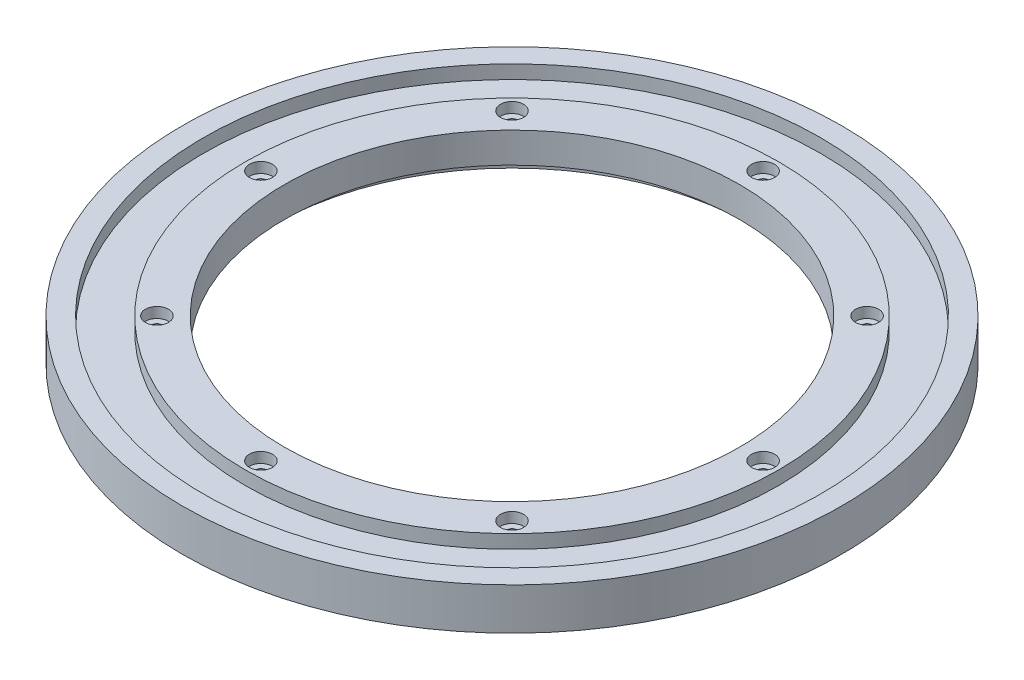
ISO-10303-21;
HEADER;
FILE_DESCRIPTION(('STEP AP214'),'2;1');
FILE_NAME('part.step','',(''),(''),'','','');
FILE_SCHEMA(('AUTOMOTIVE_DESIGN { 1 0 10303 214 1 1 1 1 }'));
ENDSEC;
DATA;
#1=APPLICATION_CONTEXT('core data for automotive mechanical design processes');
#2=APPLICATION_PROTOCOL_DEFINITION('international standard','automotive_design',2000,#1);
#3=PRODUCT_CONTEXT('',#1,'mechanical');
#4=PRODUCT('Part','Part','',(#3));
#5=PRODUCT_RELATED_PRODUCT_CATEGORY('part','',(#4));
#6=PRODUCT_DEFINITION_FORMATION('','',#4);
#7=PRODUCT_DEFINITION_CONTEXT('part definition',#1,'design');
#8=PRODUCT_DEFINITION('design','',#6,#7);
#9=PRODUCT_DEFINITION_SHAPE('','',#8);
#10=(LENGTH_UNIT() NAMED_UNIT(*) SI_UNIT(.MILLI.,.METRE.));
#11=(NAMED_UNIT(*) PLANE_ANGLE_UNIT() SI_UNIT($,.RADIAN.));
#12=(NAMED_UNIT(*) SI_UNIT($,.STERADIAN.) SOLID_ANGLE_UNIT());
#13=UNCERTAINTY_MEASURE_WITH_UNIT(LENGTH_MEASURE(1.E-05),#10,'distance_accuracy_value','');
#14=(GEOMETRIC_REPRESENTATION_CONTEXT(3) GLOBAL_UNCERTAINTY_ASSIGNED_CONTEXT((#13)) GLOBAL_UNIT_ASSIGNED_CONTEXT((#10,
#11,#12)) REPRESENTATION_CONTEXT('',''));
#15=CARTESIAN_POINT('',(0.,0.,0.));
#16=DIRECTION('',(0.,0.,1.));
#17=DIRECTION('',(1.,0.,0.));
#18=AXIS2_PLACEMENT_3D('',#15,#16,#17);
#19=CARTESIAN_POINT('',(-169.705627484764,-5.28767123287549,-169.705627484753));
#20=DIRECTION('',(0.,1.,0.));
#21=DIRECTION('',(0.,0.,1.));
#22=AXIS2_PLACEMENT_3D('',#19,#20,#21);
#23=CYLINDRICAL_SURFACE('',#22,4.99999999999999);
#24=CARTESIAN_POINT('',(-169.705627484764,-5.28767123287549,-169.705627484753));
#25=DIRECTION('',(0.,1.,0.));
#26=DIRECTION('',(0.,0.,1.));
#27=AXIS2_PLACEMENT_3D('',#24,#25,#26);
#28=CIRCLE('',#27,4.99999999999999);
#29=CARTESIAN_POINT('',(-169.705627484764,-5.28767123287551,-164.705627484753));
#30=VERTEX_POINT('',#29);
#31=EDGE_CURVE('E74',#30,#30,#28,.T.);
#32=ORIENTED_EDGE('',*,*,#31,.F.);
#33=EDGE_LOOP('',(#32));
#34=FACE_BOUND('',#33,.T.);
#35=CARTESIAN_POINT('',(-169.705627484764,24.7123287671247,-169.705627484752));
#36=DIRECTION('',(0.,1.,0.));
#37=DIRECTION('',(0.,0.,1.));
#38=AXIS2_PLACEMENT_3D('',#35,#36,#37);
#39=CIRCLE('',#38,4.99999999999999);
#40=CARTESIAN_POINT('',(-169.705627484764,24.7123287671246,-164.705627484752));
#41=VERTEX_POINT('',#40);
#42=EDGE_CURVE('E38',#41,#41,#39,.F.);
#43=ORIENTED_EDGE('',*,*,#42,.F.);
#44=EDGE_LOOP('',(#43));
#45=FACE_BOUND('',#44,.T.);
#46=ADVANCED_FACE('F34',(#34,#45),#23,.F.);
#47=CARTESIAN_POINT('',(-239.999999999973,-5.28767123287607,2.66847977208361E-11));
#48=DIRECTION('',(0.,1.,0.));
#49=DIRECTION('',(0.,0.,1.));
#50=AXIS2_PLACEMENT_3D('',#47,#48,#49);
#51=CYLINDRICAL_SURFACE('',#50,4.99999999999999);
#52=CARTESIAN_POINT('',(-239.999999999973,-5.28767123287607,2.66847977208361E-11));
#53=DIRECTION('',(0.,1.,0.));
#54=DIRECTION('',(0.,0.,1.));
#55=AXIS2_PLACEMENT_3D('',#52,#53,#54);
#56=CIRCLE('',#55,4.99999999999999);
#57=CARTESIAN_POINT('',(-239.999999999973,-5.28767123287609,5.00000000002667));
#58=VERTEX_POINT('',#57);
#59=EDGE_CURVE('E78',#58,#58,#56,.T.);
#60=ORIENTED_EDGE('',*,*,#59,.F.);
#61=EDGE_LOOP('',(#60));
#62=FACE_BOUND('',#61,.T.);
#63=CARTESIAN_POINT('',(-239.999999999973,24.7123287671241,2.67877051908027E-11));
#64=DIRECTION('',(0.,1.,0.));
#65=DIRECTION('',(0.,0.,1.));
#66=AXIS2_PLACEMENT_3D('',#63,#64,#65);
#67=CIRCLE('',#66,4.99999999999999);
#68=CARTESIAN_POINT('',(-239.999999999973,24.7123287671241,5.00000000002678));
#69=VERTEX_POINT('',#68);
#70=EDGE_CURVE('E69',#69,#69,#67,.F.);
#71=ORIENTED_EDGE('',*,*,#70,.F.);
#72=EDGE_LOOP('',(#71));
#73=FACE_BOUND('',#72,.T.);
#74=ADVANCED_FACE('F170',(#62,#73),#51,.F.);
#75=CARTESIAN_POINT('',(-169.705627484726,-5.28767123287666,169.70562748479));
#76=DIRECTION('',(0.,1.,0.));
#77=DIRECTION('',(0.,0.,1.));
#78=AXIS2_PLACEMENT_3D('',#75,#76,#77);
#79=CYLINDRICAL_SURFACE('',#78,4.99999999999999);
#80=CARTESIAN_POINT('',(-169.705627484726,-5.28767123287666,169.70562748479));
#81=DIRECTION('',(0.,1.,0.));
#82=DIRECTION('',(0.,0.,1.));
#83=AXIS2_PLACEMENT_3D('',#80,#81,#82);
#84=CIRCLE('',#83,4.99999999999999);
#85=CARTESIAN_POINT('',(-169.705627484726,-5.28767123287667,174.70562748479));
#86=VERTEX_POINT('',#85);
#87=EDGE_CURVE('E83',#86,#86,#84,.T.);
#88=ORIENTED_EDGE('',*,*,#87,.F.);
#89=EDGE_LOOP('',(#88));
#90=FACE_BOUND('',#89,.T.);
#91=CARTESIAN_POINT('',(-169.705627484726,24.7123287671235,169.70562748479));
#92=DIRECTION('',(0.,1.,0.));
#93=DIRECTION('',(0.,0.,1.));
#94=AXIS2_PLACEMENT_3D('',#91,#92,#93);
#95=CIRCLE('',#94,4.99999999999999);
#96=CARTESIAN_POINT('',(-169.705627484726,24.7123287671235,174.70562748479));
#97=VERTEX_POINT('',#96);
#98=EDGE_CURVE('E67',#97,#97,#95,.F.);
#99=ORIENTED_EDGE('',*,*,#98,.F.);
#100=EDGE_LOOP('',(#99));
#101=FACE_BOUND('',#100,.T.);
#102=ADVANCED_FACE('F176',(#90,#101),#79,.F.);
#103=CARTESIAN_POINT('',(5.33470884532192E-11,-5.2876712328769,240.));
#104=DIRECTION('',(0.,1.,0.));
#105=DIRECTION('',(0.,0.,1.));
#106=AXIS2_PLACEMENT_3D('',#103,#104,#105);
#107=CYLINDRICAL_SURFACE('',#106,5.);
#108=CARTESIAN_POINT('',(5.33470884532192E-11,-5.2876712328769,240.));
#109=DIRECTION('',(0.,1.,0.));
#110=DIRECTION('',(0.,0.,1.));
#111=AXIS2_PLACEMENT_3D('',#108,#109,#110);
#112=CIRCLE('',#111,5.);
#113=CARTESIAN_POINT('',(5.33470884532192E-11,-5.28767123287692,245.));
#114=VERTEX_POINT('',#113);
#115=EDGE_CURVE('E484',#114,#114,#112,.T.);
#116=ORIENTED_EDGE('',*,*,#115,.F.);
#117=EDGE_LOOP('',(#116));
#118=FACE_BOUND('',#117,.T.);
#119=CARTESIAN_POINT('',(5.33470884532192E-11,24.7123287671233,240.));
#120=DIRECTION('',(0.,1.,0.));
#121=DIRECTION('',(0.,0.,1.));
#122=AXIS2_PLACEMENT_3D('',#119,#120,#121);
#123=CIRCLE('',#122,5.);
#124=CARTESIAN_POINT('',(5.33470884532192E-11,24.7123287671232,245.));
#125=VERTEX_POINT('',#124);
#126=EDGE_CURVE('E64',#125,#125,#123,.F.);
#127=ORIENTED_EDGE('',*,*,#126,.F.);
#128=EDGE_LOOP('',(#127));
#129=FACE_BOUND('',#128,.T.);
#130=ADVANCED_FACE('F395',(#118,#129),#107,.F.);
#131=CARTESIAN_POINT('',(169.705627484817,-5.28767123287666,169.705627484753));
#132=DIRECTION('',(0.,1.,0.));
#133=DIRECTION('',(0.,0.,1.));
#134=AXIS2_PLACEMENT_3D('',#131,#132,#133);
#135=CYLINDRICAL_SURFACE('',#134,4.99999999999999);
#136=CARTESIAN_POINT('',(169.705627484817,-5.28767123287666,169.705627484753));
#137=DIRECTION('',(0.,1.,0.));
#138=DIRECTION('',(0.,0.,1.));
#139=AXIS2_PLACEMENT_3D('',#136,#137,#138);
#140=CIRCLE('',#139,4.99999999999999);
#141=CARTESIAN_POINT('',(169.705627484817,-5.28767123287667,174.705627484753));
#142=VERTEX_POINT('',#141);
#143=EDGE_CURVE('E478',#142,#142,#140,.T.);
#144=ORIENTED_EDGE('',*,*,#143,.F.);
#145=EDGE_LOOP('',(#144));
#146=FACE_BOUND('',#145,.T.);
#147=CARTESIAN_POINT('',(169.705627484817,24.7123287671235,169.705627484753));
#148=DIRECTION('',(0.,1.,0.));
#149=DIRECTION('',(0.,0.,1.));
#150=AXIS2_PLACEMENT_3D('',#147,#148,#149);
#151=CIRCLE('',#150,4.99999999999999);
#152=CARTESIAN_POINT('',(169.705627484817,24.7123287671235,174.705627484753));
#153=VERTEX_POINT('',#152);
#154=EDGE_CURVE('E61',#153,#153,#151,.F.);
#155=ORIENTED_EDGE('',*,*,#154,.F.);
#156=EDGE_LOOP('',(#155));
#157=FACE_BOUND('',#156,.T.);
#158=ADVANCED_FACE('F403',(#146,#157),#135,.F.);
#159=CARTESIAN_POINT('',(240.000000000027,-5.28767123287607,-2.66916822555626E-11));
#160=DIRECTION('',(0.,1.,0.));
#161=DIRECTION('',(0.,0.,1.));
#162=AXIS2_PLACEMENT_3D('',#159,#160,#161);
#163=CYLINDRICAL_SURFACE('',#162,4.99999999999999);
#164=CARTESIAN_POINT('',(240.000000000027,-5.28767123287607,-2.66916822555626E-11));
#165=DIRECTION('',(0.,1.,0.));
#166=DIRECTION('',(0.,0.,1.));
#167=AXIS2_PLACEMENT_3D('',#164,#165,#166);
#168=CIRCLE('',#167,4.99999999999999);
#169=CARTESIAN_POINT('',(240.000000000027,-5.28767123287609,4.9999999999733));
#170=VERTEX_POINT('',#169);
#171=EDGE_CURVE('E473',#170,#170,#168,.T.);
#172=ORIENTED_EDGE('',*,*,#171,.F.);
#173=EDGE_LOOP('',(#172));
#174=FACE_BOUND('',#173,.T.);
#175=CARTESIAN_POINT('',(240.000000000027,24.7123287671241,-2.6588774785596E-11));
#176=DIRECTION('',(0.,1.,0.));
#177=DIRECTION('',(0.,0.,1.));
#178=AXIS2_PLACEMENT_3D('',#175,#176,#177);
#179=CIRCLE('',#178,4.99999999999999);
#180=CARTESIAN_POINT('',(240.000000000027,24.7123287671241,4.9999999999734));
#181=VERTEX_POINT('',#180);
#182=EDGE_CURVE('E58',#181,#181,#179,.F.);
#183=ORIENTED_EDGE('',*,*,#182,.F.);
#184=EDGE_LOOP('',(#183));
#185=FACE_BOUND('',#184,.T.);
#186=ADVANCED_FACE('F412',(#174,#185),#163,.F.);
#187=CARTESIAN_POINT('',(169.705627484779,-5.28767123287549,-169.70562748479));
#188=DIRECTION('',(0.,1.,0.));
#189=DIRECTION('',(0.,0.,1.));
#190=AXIS2_PLACEMENT_3D('',#187,#188,#189);
#191=CYLINDRICAL_SURFACE('',#190,4.99999999999999);
#192=CARTESIAN_POINT('',(169.705627484779,-5.28767123287549,-169.70562748479));
#193=DIRECTION('',(0.,1.,0.));
#194=DIRECTION('',(0.,0.,1.));
#195=AXIS2_PLACEMENT_3D('',#192,#193,#194);
#196=CIRCLE('',#195,4.99999999999999);
#197=CARTESIAN_POINT('',(169.705627484779,-5.28767123287551,-164.70562748479));
#198=VERTEX_POINT('',#197);
#199=EDGE_CURVE('E469',#198,#198,#196,.T.);
#200=ORIENTED_EDGE('',*,*,#199,.F.);
#201=EDGE_LOOP('',(#200));
#202=FACE_BOUND('',#201,.T.);
#203=CARTESIAN_POINT('',(169.705627484779,24.7123287671247,-169.70562748479));
#204=DIRECTION('',(0.,1.,0.));
#205=DIRECTION('',(0.,0.,1.));
#206=AXIS2_PLACEMENT_3D('',#203,#204,#205);
#207=CIRCLE('',#206,4.99999999999999);
#208=CARTESIAN_POINT('',(169.705627484779,24.7123287671246,-164.70562748479));
#209=VERTEX_POINT('',#208);
#210=EDGE_CURVE('E54',#209,#209,#207,.F.);
#211=ORIENTED_EDGE('',*,*,#210,.F.);
#212=EDGE_LOOP('',(#211));
#213=FACE_BOUND('',#212,.T.);
#214=ADVANCED_FACE('F166',(#202,#213),#191,.F.);
#215=CARTESIAN_POINT('',(0.,-5.28767123287525,-240.));
#216=DIRECTION('',(0.,1.,0.));
#217=DIRECTION('',(0.,0.,1.));
#218=AXIS2_PLACEMENT_3D('',#215,#216,#217);
#219=CYLINDRICAL_SURFACE('',#218,5.);
#220=CARTESIAN_POINT('',(0.,-5.28767123287525,-240.));
#221=DIRECTION('',(0.,1.,0.));
#222=DIRECTION('',(0.,0.,1.));
#223=AXIS2_PLACEMENT_3D('',#220,#221,#222);
#224=CIRCLE('',#223,5.);
#225=CARTESIAN_POINT('',(0.,-5.28767123287527,-235.));
#226=VERTEX_POINT('',#225);
#227=EDGE_CURVE('E91',#226,#226,#224,.T.);
#228=ORIENTED_EDGE('',*,*,#227,.F.);
#229=EDGE_LOOP('',(#228));
#230=FACE_BOUND('',#229,.T.);
#231=CARTESIAN_POINT('',(0.,24.7123287671249,-240.));
#232=DIRECTION('',(0.,1.,0.));
#233=DIRECTION('',(0.,0.,1.));
#234=AXIS2_PLACEMENT_3D('',#231,#232,#233);
#235=CIRCLE('',#234,5.);
#236=CARTESIAN_POINT('',(0.,24.7123287671249,-235.));
#237=VERTEX_POINT('',#236);
#238=EDGE_CURVE('E51',#237,#237,#235,.F.);
#239=ORIENTED_EDGE('',*,*,#238,.F.);
#240=EDGE_LOOP('',(#239));
#241=FACE_BOUND('',#240,.T.);
#242=ADVANCED_FACE('F160',(#230,#241),#219,.F.);
#243=CARTESIAN_POINT('',(0.,-1465.13643598557,-5.02578279277057E-12));
#244=DIRECTION('',(0.,-1.,0.));
#245=DIRECTION('',(0.,0.,-1.));
#246=AXIS2_PLACEMENT_3D('',#243,#244,#245);
#247=CYLINDRICAL_SURFACE('',#246,314.999999999995);
#248=CARTESIAN_POINT('',(0.,-5.28767123287555,0.));
#249=DIRECTION('',(0.,-1.,0.));
#250=DIRECTION('',(0.,0.,-1.));
#251=AXIS2_PLACEMENT_3D('',#248,#249,#250);
#252=CIRCLE('',#251,314.999999999995);
#253=CARTESIAN_POINT('',(0.,-5.28767123287447,-314.999999999995));
#254=VERTEX_POINT('',#253);
#255=EDGE_CURVE('E87',#254,#254,#252,.T.);
#256=ORIENTED_EDGE('',*,*,#255,.F.);
#257=EDGE_LOOP('',(#256));
#258=FACE_BOUND('',#257,.T.);
#259=CARTESIAN_POINT('',(0.,34.7123287671243,1.19071931002422E-13));
#260=DIRECTION('',(0.,-1.,0.));
#261=DIRECTION('',(0.,0.,-1.));
#262=AXIS2_PLACEMENT_3D('',#259,#260,#261);
#263=CIRCLE('',#262,314.999999999995);
#264=CARTESIAN_POINT('',(0.,34.7123287671253,-314.999999999995));
#265=VERTEX_POINT('',#264);
#266=EDGE_CURVE('E10',#265,#265,#263,.T.);
#267=ORIENTED_EDGE('',*,*,#266,.T.);
#268=EDGE_LOOP('',(#267));
#269=FACE_BOUND('',#268,.T.);
#270=ADVANCED_FACE('F36',(#258,#269),#247,.T.);
#271=CARTESIAN_POINT('',(0.,34.7123287671232,314.999999999995));
#272=DIRECTION('',(0.,-1.,0.));
#273=DIRECTION('',(0.,0.,-1.));
#274=AXIS2_PLACEMENT_3D('',#271,#272,#273);
#275=PLANE('',#274);
#276=ORIENTED_EDGE('',*,*,#266,.F.);
#277=EDGE_LOOP('',(#276));
#278=FACE_BOUND('',#277,.T.);
#279=CARTESIAN_POINT('',(0.,34.7123287671243,1.19071931002422E-13));
#280=DIRECTION('',(0.,-1.,0.));
#281=DIRECTION('',(0.,0.,-1.));
#282=AXIS2_PLACEMENT_3D('',#279,#280,#281);
#283=CIRCLE('',#282,294.999999999995);
#284=CARTESIAN_POINT('',(0.,34.7123287671253,-294.999999999995));
#285=VERTEX_POINT('',#284);
#286=EDGE_CURVE('E42',#285,#285,#283,.T.);
#287=ORIENTED_EDGE('',*,*,#286,.T.);
#288=EDGE_LOOP('',(#287));
#289=FACE_BOUND('',#288,.T.);
#290=ADVANCED_FACE('F159',(#278,#289),#275,.F.);
#291=CARTESIAN_POINT('',(0.,-1465.13643598557,-5.02578279277057E-12));
#292=DIRECTION('',(0.,-1.,0.));
#293=DIRECTION('',(0.,0.,-1.));
#294=AXIS2_PLACEMENT_3D('',#291,#292,#293);
#295=CYLINDRICAL_SURFACE('',#294,294.999999999995);
#296=ORIENTED_EDGE('',*,*,#286,.F.);
#297=EDGE_LOOP('',(#296));
#298=FACE_BOUND('',#297,.T.);
#299=CARTESIAN_POINT('',(0.,21.7123287671244,0.));
#300=DIRECTION('',(0.,-1.,0.));
#301=DIRECTION('',(0.,0.,-1.));
#302=AXIS2_PLACEMENT_3D('',#299,#300,#301);
#303=CIRCLE('',#302,294.999999999995);
#304=CARTESIAN_POINT('',(0.,21.7123287671254,-294.999999999995));
#305=VERTEX_POINT('',#304);
#306=EDGE_CURVE('E47',#305,#305,#303,.T.);
#307=ORIENTED_EDGE('',*,*,#306,.T.);
#308=EDGE_LOOP('',(#307));
#309=FACE_BOUND('',#308,.T.);
#310=ADVANCED_FACE('F111',(#298,#309),#295,.F.);
#311=CARTESIAN_POINT('',(0.,21.7123287671232,294.999999999995));
#312=DIRECTION('',(0.,-1.,0.));
#313=DIRECTION('',(0.,0.,-1.));
#314=AXIS2_PLACEMENT_3D('',#311,#312,#313);
#315=PLANE('',#314);
#316=ORIENTED_EDGE('',*,*,#306,.F.);
#317=EDGE_LOOP('',(#316));
#318=FACE_BOUND('',#317,.T.);
#319=CARTESIAN_POINT('',(0.,21.7123287671241,0.));
#320=DIRECTION('',(0.,-1.,0.));
#321=DIRECTION('',(0.,0.,-1.));
#322=AXIS2_PLACEMENT_3D('',#319,#320,#321);
#323=CIRCLE('',#322,254.999999999995);
#324=CARTESIAN_POINT('',(0.,21.712328767125,-254.999999999995));
#325=VERTEX_POINT('',#324);
#326=EDGE_CURVE('E106',#325,#325,#323,.T.);
#327=ORIENTED_EDGE('',*,*,#326,.T.);
#328=EDGE_LOOP('',(#327));
#329=FACE_BOUND('',#328,.T.);
#330=ADVANCED_FACE('F113',(#318,#329),#315,.F.);
#331=CARTESIAN_POINT('',(0.,-1465.13643598557,-5.02578279277057E-12));
#332=DIRECTION('',(0.,-1.,0.));
#333=DIRECTION('',(0.,0.,-1.));
#334=AXIS2_PLACEMENT_3D('',#331,#332,#333);
#335=CYLINDRICAL_SURFACE('',#334,254.999999999995);
#336=ORIENTED_EDGE('',*,*,#326,.F.);
#337=EDGE_LOOP('',(#336));
#338=FACE_BOUND('',#337,.T.);
#339=CARTESIAN_POINT('',(0.,34.7123287671243,1.19071931002422E-13));
#340=DIRECTION('',(0.,-1.,0.));
#341=DIRECTION('',(0.,0.,-1.));
#342=AXIS2_PLACEMENT_3D('',#339,#340,#341);
#343=CIRCLE('',#342,254.999999999995);
#344=CARTESIAN_POINT('',(0.,34.7123287671251,-254.999999999995));
#345=VERTEX_POINT('',#344);
#346=EDGE_CURVE('E103',#345,#345,#343,.T.);
#347=ORIENTED_EDGE('',*,*,#346,.T.);
#348=EDGE_LOOP('',(#347));
#349=FACE_BOUND('',#348,.T.);
#350=ADVANCED_FACE('F116',(#338,#349),#335,.T.);
#351=CARTESIAN_POINT('',(0.,34.7123287671232,254.999999999995));
#352=DIRECTION('',(0.,-1.,0.));
#353=DIRECTION('',(0.,0.,-1.));
#354=AXIS2_PLACEMENT_3D('',#351,#352,#353);
#355=PLANE('',#354);
#356=CARTESIAN_POINT('',(0.,34.7123287671249,-240.));
#357=DIRECTION('',(0.,1.,0.));
#358=DIRECTION('',(0.,0.,1.));
#359=AXIS2_PLACEMENT_3D('',#356,#357,#358);
#360=CIRCLE('',#359,11.);
#361=CARTESIAN_POINT('',(0.,34.7123287671249,-229.));
#362=VERTEX_POINT('',#361);
#363=EDGE_CURVE('E547',#362,#362,#360,.T.);
#364=ORIENTED_EDGE('',*,*,#363,.F.);
#365=EDGE_LOOP('',(#364));
#366=FACE_BOUND('',#365,.T.);
#367=CARTESIAN_POINT('',(169.705627484777,34.7123287671247,-169.705627484786));
#368=DIRECTION('',(0.,1.,0.));
#369=DIRECTION('',(0.,0.,1.));
#370=AXIS2_PLACEMENT_3D('',#367,#368,#369);
#371=CIRCLE('',#370,11.0000000000019);
#372=CARTESIAN_POINT('',(169.705627484777,34.7123287671246,-158.705627484784));
#373=VERTEX_POINT('',#372);
#374=EDGE_CURVE('E541',#373,#373,#371,.T.);
#375=ORIENTED_EDGE('',*,*,#374,.F.);
#376=EDGE_LOOP('',(#375));
#377=FACE_BOUND('',#376,.T.);
#378=CARTESIAN_POINT('',(240.00000000002,34.7123287671241,-2.03004715741192E-11));
#379=DIRECTION('',(0.,1.,0.));
#380=DIRECTION('',(0.,0.,1.));
#381=AXIS2_PLACEMENT_3D('',#378,#379,#380);
#382=CIRCLE('',#381,11.0000000000144);
#383=CARTESIAN_POINT('',(240.00000000002,34.712328767124,10.9999999999941));
#384=VERTEX_POINT('',#383);
#385=EDGE_CURVE('E535',#384,#384,#382,.T.);
#386=ORIENTED_EDGE('',*,*,#385,.F.);
#387=EDGE_LOOP('',(#386));
#388=FACE_BOUND('',#387,.T.);
#389=CARTESIAN_POINT('',(169.705627484806,34.7123287671235,169.705627484757));
#390=DIRECTION('',(0.,1.,0.));
#391=DIRECTION('',(0.,0.,1.));
#392=AXIS2_PLACEMENT_3D('',#389,#390,#391);
#393=CIRCLE('',#392,11.0000000000303);
#394=CARTESIAN_POINT('',(169.705627484806,34.7123287671235,180.705627484787));
#395=VERTEX_POINT('',#394);
#396=EDGE_CURVE('E529',#395,#395,#393,.T.);
#397=ORIENTED_EDGE('',*,*,#396,.F.);
#398=EDGE_LOOP('',(#397));
#399=FACE_BOUND('',#398,.T.);
#400=CARTESIAN_POINT('',(4.08390870102432E-11,34.7123287671233,240.));
#401=DIRECTION('',(0.,1.,0.));
#402=DIRECTION('',(0.,0.,1.));
#403=AXIS2_PLACEMENT_3D('',#400,#401,#402);
#404=CIRCLE('',#403,11.0000000000407);
#405=CARTESIAN_POINT('',(4.08390870102432E-11,34.7123287671232,251.000000000041));
#406=VERTEX_POINT('',#405);
#407=EDGE_CURVE('E523',#406,#406,#404,.T.);
#408=ORIENTED_EDGE('',*,*,#407,.F.);
#409=EDGE_LOOP('',(#408));
#410=FACE_BOUND('',#409,.T.);
#411=CARTESIAN_POINT('',(-169.705627484737,34.7123287671235,169.705627484786));
#412=DIRECTION('',(0.,1.,0.));
#413=DIRECTION('',(0.,0.,1.));
#414=AXIS2_PLACEMENT_3D('',#411,#412,#413);
#415=CIRCLE('',#414,11.0000000000396);
#416=CARTESIAN_POINT('',(-169.705627484737,34.7123287671235,180.705627484826));
#417=VERTEX_POINT('',#416);
#418=EDGE_CURVE('E517',#417,#417,#415,.T.);
#419=ORIENTED_EDGE('',*,*,#418,.F.);
#420=EDGE_LOOP('',(#419));
#421=FACE_BOUND('',#420,.T.);
#422=CARTESIAN_POINT('',(-239.99999999998,34.7123287671241,2.05680069593035E-11));
#423=DIRECTION('',(0.,1.,0.));
#424=DIRECTION('',(0.,0.,1.));
#425=AXIS2_PLACEMENT_3D('',#422,#423,#424);
#426=CIRCLE('',#425,11.0000000000279);
#427=CARTESIAN_POINT('',(-239.99999999998,34.712328767124,11.0000000000485));
#428=VERTEX_POINT('',#427);
#429=EDGE_CURVE('E511',#428,#428,#426,.T.);
#430=ORIENTED_EDGE('',*,*,#429,.F.);
#431=EDGE_LOOP('',(#430));
#432=FACE_BOUND('',#431,.T.);
#433=CARTESIAN_POINT('',(-169.705627484765,34.7123287671247,-169.705627484757));
#434=DIRECTION('',(0.,1.,0.));
#435=DIRECTION('',(0.,0.,1.));
#436=AXIS2_PLACEMENT_3D('',#433,#434,#435);
#437=CIRCLE('',#436,11.0000000000128);
#438=CARTESIAN_POINT('',(-169.705627484765,34.7123287671246,-158.705627484744));
#439=VERTEX_POINT('',#438);
#440=EDGE_CURVE('E505',#439,#439,#437,.T.);
#441=ORIENTED_EDGE('',*,*,#440,.F.);
#442=EDGE_LOOP('',(#441));
#443=FACE_BOUND('',#442,.T.);
#444=ORIENTED_EDGE('',*,*,#346,.F.);
#445=EDGE_LOOP('',(#444));
#446=FACE_BOUND('',#445,.T.);
#447=CARTESIAN_POINT('',(0.,34.712328767124,1.19071931002421E-13));
#448=DIRECTION('',(0.,-1.,0.));
#449=DIRECTION('',(0.,0.,-1.));
#450=AXIS2_PLACEMENT_3D('',#447,#448,#449);
#451=CIRCLE('',#450,217.499999999995);
#452=CARTESIAN_POINT('',(0.,34.7123287671248,-217.499999999995));
#453=VERTEX_POINT('',#452);
#454=EDGE_CURVE('E100',#453,#453,#451,.T.);
#455=ORIENTED_EDGE('',*,*,#454,.T.);
#456=EDGE_LOOP('',(#455));
#457=FACE_BOUND('',#456,.T.);
#458=ADVANCED_FACE('F122',(#366,#377,#388,#399,#410,#421,#432,#443,#446,#457),#355,.F.);
#459=CARTESIAN_POINT('',(0.,-1465.13643598557,-5.02578279277057E-12));
#460=DIRECTION('',(0.,-1.,0.));
#461=DIRECTION('',(0.,0.,-1.));
#462=AXIS2_PLACEMENT_3D('',#459,#460,#461);
#463=CYLINDRICAL_SURFACE('',#462,217.499999999995);
#464=ORIENTED_EDGE('',*,*,#454,.F.);
#465=EDGE_LOOP('',(#464));
#466=FACE_BOUND('',#465,.T.);
#467=CARTESIAN_POINT('',(0.,5.71232876712391,0.));
#468=DIRECTION('',(0.,-1.,0.));
#469=DIRECTION('',(0.,0.,-1.));
#470=AXIS2_PLACEMENT_3D('',#467,#468,#469);
#471=CIRCLE('',#470,217.499999999995);
#472=CARTESIAN_POINT('',(0.,5.71232876712465,-217.499999999995));
#473=VERTEX_POINT('',#472);
#474=EDGE_CURVE('E97',#473,#473,#471,.T.);
#475=ORIENTED_EDGE('',*,*,#474,.T.);
#476=EDGE_LOOP('',(#475));
#477=FACE_BOUND('',#476,.T.);
#478=ADVANCED_FACE('F128',(#466,#477),#463,.F.);
#479=CARTESIAN_POINT('',(0.,5.71232876712329,217.499999999995));
#480=DIRECTION('',(0.,1.,0.));
#481=DIRECTION('',(0.,0.,1.));
#482=AXIS2_PLACEMENT_3D('',#479,#480,#481);
#483=PLANE('',#482);
#484=ORIENTED_EDGE('',*,*,#474,.F.);
#485=EDGE_LOOP('',(#484));
#486=FACE_BOUND('',#485,.T.);
#487=CARTESIAN_POINT('',(0.,5.71232876712413,0.));
#488=DIRECTION('',(0.,-1.,0.));
#489=DIRECTION('',(0.,0.,-1.));
#490=AXIS2_PLACEMENT_3D('',#487,#488,#489);
#491=CIRCLE('',#490,229.499999999995);
#492=CARTESIAN_POINT('',(0.,5.71232876712492,-229.499999999995));
#493=VERTEX_POINT('',#492);
#494=EDGE_CURVE('E94',#493,#493,#491,.T.);
#495=ORIENTED_EDGE('',*,*,#494,.T.);
#496=EDGE_LOOP('',(#495));
#497=FACE_BOUND('',#496,.T.);
#498=ADVANCED_FACE('F135',(#486,#497),#483,.F.);
#499=CARTESIAN_POINT('',(0.,-1465.13643598557,-5.02578279277057E-12));
#500=DIRECTION('',(0.,-1.,0.));
#501=DIRECTION('',(0.,0.,-1.));
#502=AXIS2_PLACEMENT_3D('',#499,#500,#501);
#503=CYLINDRICAL_SURFACE('',#502,229.499999999995);
#504=ORIENTED_EDGE('',*,*,#494,.F.);
#505=EDGE_LOOP('',(#504));
#506=FACE_BOUND('',#505,.T.);
#507=CARTESIAN_POINT('',(0.,-5.28767123287577,0.));
#508=DIRECTION('',(0.,-1.,0.));
#509=DIRECTION('',(0.,0.,-1.));
#510=AXIS2_PLACEMENT_3D('',#507,#508,#509);
#511=CIRCLE('',#510,229.499999999995);
#512=CARTESIAN_POINT('',(0.,-5.28767123287498,-229.499999999995));
#513=VERTEX_POINT('',#512);
#514=EDGE_CURVE('E90',#513,#513,#511,.T.);
#515=ORIENTED_EDGE('',*,*,#514,.T.);
#516=EDGE_LOOP('',(#515));
#517=FACE_BOUND('',#516,.T.);
#518=ADVANCED_FACE('F141',(#506,#517),#503,.F.);
#519=CARTESIAN_POINT('',(0.,-5.28767123287659,229.499999999995));
#520=DIRECTION('',(0.,1.,0.));
#521=DIRECTION('',(0.,0.,1.));
#522=AXIS2_PLACEMENT_3D('',#519,#520,#521);
#523=PLANE('',#522);
#524=ORIENTED_EDGE('',*,*,#227,.T.);
#525=EDGE_LOOP('',(#524));
#526=FACE_BOUND('',#525,.T.);
#527=ORIENTED_EDGE('',*,*,#199,.T.);
#528=EDGE_LOOP('',(#527));
#529=FACE_BOUND('',#528,.T.);
#530=ORIENTED_EDGE('',*,*,#171,.T.);
#531=EDGE_LOOP('',(#530));
#532=FACE_BOUND('',#531,.T.);
#533=ORIENTED_EDGE('',*,*,#143,.T.);
#534=EDGE_LOOP('',(#533));
#535=FACE_BOUND('',#534,.T.);
#536=ORIENTED_EDGE('',*,*,#115,.T.);
#537=EDGE_LOOP('',(#536));
#538=FACE_BOUND('',#537,.T.);
#539=ORIENTED_EDGE('',*,*,#87,.T.);
#540=EDGE_LOOP('',(#539));
#541=FACE_BOUND('',#540,.T.);
#542=ORIENTED_EDGE('',*,*,#59,.T.);
#543=EDGE_LOOP('',(#542));
#544=FACE_BOUND('',#543,.T.);
#545=ORIENTED_EDGE('',*,*,#31,.T.);
#546=EDGE_LOOP('',(#545));
#547=FACE_BOUND('',#546,.T.);
#548=ORIENTED_EDGE('',*,*,#514,.F.);
#549=EDGE_LOOP('',(#548));
#550=FACE_BOUND('',#549,.T.);
#551=ORIENTED_EDGE('',*,*,#255,.T.);
#552=EDGE_LOOP('',(#551));
#553=FACE_BOUND('',#552,.T.);
#554=ADVANCED_FACE('F147',(#526,#529,#532,#535,#538,#541,#544,#547,#550,#553),#523,.F.);
#555=CARTESIAN_POINT('',(0.,24.7123287671249,-240.));
#556=DIRECTION('',(0.,1.,0.));
#557=DIRECTION('',(0.,0.,1.));
#558=AXIS2_PLACEMENT_3D('',#555,#556,#557);
#559=PLANE('',#558);
#560=CARTESIAN_POINT('',(0.,24.7123287671249,-240.));
#561=DIRECTION('',(0.,1.,0.));
#562=DIRECTION('',(0.,0.,1.));
#563=AXIS2_PLACEMENT_3D('',#560,#561,#562);
#564=CIRCLE('',#563,11.);
#565=CARTESIAN_POINT('',(0.,24.7123287671249,-229.));
#566=VERTEX_POINT('',#565);
#567=EDGE_CURVE('E55',#566,#566,#564,.T.);
#568=ORIENTED_EDGE('',*,*,#567,.T.);
#569=EDGE_LOOP('',(#568));
#570=FACE_BOUND('',#569,.T.);
#571=ORIENTED_EDGE('',*,*,#238,.T.);
#572=EDGE_LOOP('',(#571));
#573=FACE_BOUND('',#572,.T.);
#574=ADVANCED_FACE('F153',(#570,#573),#559,.T.);
#575=CARTESIAN_POINT('',(0.,24.7123287671249,-240.));
#576=DIRECTION('',(0.,1.,0.));
#577=DIRECTION('',(0.,0.,1.));
#578=AXIS2_PLACEMENT_3D('',#575,#576,#577);
#579=CYLINDRICAL_SURFACE('',#578,11.);
#580=ORIENTED_EDGE('',*,*,#567,.F.);
#581=EDGE_LOOP('',(#580));
#582=FACE_BOUND('',#581,.T.);
#583=ORIENTED_EDGE('',*,*,#363,.T.);
#584=EDGE_LOOP('',(#583));
#585=FACE_BOUND('',#584,.T.);
#586=ADVANCED_FACE('F225',(#582,#585),#579,.F.);
#587=CARTESIAN_POINT('',(169.705627484777,24.7123287671247,-169.705627484786));
#588=DIRECTION('',(0.,1.,0.));
#589=DIRECTION('',(0.,0.,1.));
#590=AXIS2_PLACEMENT_3D('',#587,#588,#589);
#591=PLANE('',#590);
#592=CARTESIAN_POINT('',(169.705627484777,24.7123287671247,-169.705627484786));
#593=DIRECTION('',(0.,1.,0.));
#594=DIRECTION('',(0.,0.,1.));
#595=AXIS2_PLACEMENT_3D('',#592,#593,#594);
#596=CIRCLE('',#595,11.0000000000019);
#597=CARTESIAN_POINT('',(169.705627484777,24.7123287671246,-158.705627484784));
#598=VERTEX_POINT('',#597);
#599=EDGE_CURVE('E544',#598,#598,#596,.T.);
#600=ORIENTED_EDGE('',*,*,#599,.T.);
#601=EDGE_LOOP('',(#600));
#602=FACE_BOUND('',#601,.T.);
#603=ORIENTED_EDGE('',*,*,#210,.T.);
#604=EDGE_LOOP('',(#603));
#605=FACE_BOUND('',#604,.T.);
#606=ADVANCED_FACE('F233',(#602,#605),#591,.T.);
#607=CARTESIAN_POINT('',(169.705627484777,24.7123287671247,-169.705627484786));
#608=DIRECTION('',(0.,1.,0.));
#609=DIRECTION('',(0.,0.,1.));
#610=AXIS2_PLACEMENT_3D('',#607,#608,#609);
#611=CYLINDRICAL_SURFACE('',#610,11.0000000000019);
#612=ORIENTED_EDGE('',*,*,#599,.F.);
#613=EDGE_LOOP('',(#612));
#614=FACE_BOUND('',#613,.T.);
#615=ORIENTED_EDGE('',*,*,#374,.T.);
#616=EDGE_LOOP('',(#615));
#617=FACE_BOUND('',#616,.T.);
#618=ADVANCED_FACE('F241',(#614,#617),#611,.F.);
#619=CARTESIAN_POINT('',(240.00000000002,24.7123287671241,-2.0334774064108E-11));
#620=DIRECTION('',(0.,1.,0.));
#621=DIRECTION('',(0.,0.,1.));
#622=AXIS2_PLACEMENT_3D('',#619,#620,#621);
#623=PLANE('',#622);
#624=CARTESIAN_POINT('',(240.00000000002,24.7123287671241,-2.0334774064108E-11));
#625=DIRECTION('',(0.,1.,0.));
#626=DIRECTION('',(0.,0.,1.));
#627=AXIS2_PLACEMENT_3D('',#624,#625,#626);
#628=CIRCLE('',#627,11.0000000000144);
#629=CARTESIAN_POINT('',(240.00000000002,24.712328767124,10.999999999994));
#630=VERTEX_POINT('',#629);
#631=EDGE_CURVE('E538',#630,#630,#628,.T.);
#632=ORIENTED_EDGE('',*,*,#631,.T.);
#633=EDGE_LOOP('',(#632));
#634=FACE_BOUND('',#633,.T.);
#635=ORIENTED_EDGE('',*,*,#182,.T.);
#636=EDGE_LOOP('',(#635));
#637=FACE_BOUND('',#636,.T.);
#638=ADVANCED_FACE('F249',(#634,#637),#623,.T.);
#639=CARTESIAN_POINT('',(240.00000000002,24.7123287671241,-2.0334774064108E-11));
#640=DIRECTION('',(0.,1.,0.));
#641=DIRECTION('',(0.,0.,1.));
#642=AXIS2_PLACEMENT_3D('',#639,#640,#641);
#643=CYLINDRICAL_SURFACE('',#642,11.0000000000144);
#644=ORIENTED_EDGE('',*,*,#631,.F.);
#645=EDGE_LOOP('',(#644));
#646=FACE_BOUND('',#645,.T.);
#647=ORIENTED_EDGE('',*,*,#385,.T.);
#648=EDGE_LOOP('',(#647));
#649=FACE_BOUND('',#648,.T.);
#650=ADVANCED_FACE('F257',(#646,#649),#643,.F.);
#651=CARTESIAN_POINT('',(169.705627484806,24.7123287671235,169.705627484757));
#652=DIRECTION('',(0.,1.,0.));
#653=DIRECTION('',(0.,0.,1.));
#654=AXIS2_PLACEMENT_3D('',#651,#652,#653);
#655=PLANE('',#654);
#656=CARTESIAN_POINT('',(169.705627484806,24.7123287671235,169.705627484757));
#657=DIRECTION('',(0.,1.,0.));
#658=DIRECTION('',(0.,0.,1.));
#659=AXIS2_PLACEMENT_3D('',#656,#657,#658);
#660=CIRCLE('',#659,11.0000000000303);
#661=CARTESIAN_POINT('',(169.705627484806,24.7123287671235,180.705627484787));
#662=VERTEX_POINT('',#661);
#663=EDGE_CURVE('E532',#662,#662,#660,.T.);
#664=ORIENTED_EDGE('',*,*,#663,.T.);
#665=EDGE_LOOP('',(#664));
#666=FACE_BOUND('',#665,.T.);
#667=ORIENTED_EDGE('',*,*,#154,.T.);
#668=EDGE_LOOP('',(#667));
#669=FACE_BOUND('',#668,.T.);
#670=ADVANCED_FACE('F265',(#666,#669),#655,.T.);
#671=CARTESIAN_POINT('',(169.705627484806,24.7123287671235,169.705627484757));
#672=DIRECTION('',(0.,1.,0.));
#673=DIRECTION('',(0.,0.,1.));
#674=AXIS2_PLACEMENT_3D('',#671,#672,#673);
#675=CYLINDRICAL_SURFACE('',#674,11.0000000000303);
#676=ORIENTED_EDGE('',*,*,#663,.F.);
#677=EDGE_LOOP('',(#676));
#678=FACE_BOUND('',#677,.T.);
#679=ORIENTED_EDGE('',*,*,#396,.T.);
#680=EDGE_LOOP('',(#679));
#681=FACE_BOUND('',#680,.T.);
#682=ADVANCED_FACE('F273',(#678,#681),#675,.F.);
#683=CARTESIAN_POINT('',(4.08390870102432E-11,24.7123287671233,240.));
#684=DIRECTION('',(0.,1.,0.));
#685=DIRECTION('',(0.,0.,1.));
#686=AXIS2_PLACEMENT_3D('',#683,#684,#685);
#687=PLANE('',#686);
#688=CARTESIAN_POINT('',(4.08390870102432E-11,24.7123287671233,240.));
#689=DIRECTION('',(0.,1.,0.));
#690=DIRECTION('',(0.,0.,1.));
#691=AXIS2_PLACEMENT_3D('',#688,#689,#690);
#692=CIRCLE('',#691,11.0000000000407);
#693=CARTESIAN_POINT('',(4.08390870102432E-11,24.7123287671232,251.000000000041));
#694=VERTEX_POINT('',#693);
#695=EDGE_CURVE('E526',#694,#694,#692,.T.);
#696=ORIENTED_EDGE('',*,*,#695,.T.);
#697=EDGE_LOOP('',(#696));
#698=FACE_BOUND('',#697,.T.);
#699=ORIENTED_EDGE('',*,*,#126,.T.);
#700=EDGE_LOOP('',(#699));
#701=FACE_BOUND('',#700,.T.);
#702=ADVANCED_FACE('F281',(#698,#701),#687,.T.);
#703=CARTESIAN_POINT('',(4.08390870102432E-11,24.7123287671233,240.));
#704=DIRECTION('',(0.,1.,0.));
#705=DIRECTION('',(0.,0.,1.));
#706=AXIS2_PLACEMENT_3D('',#703,#704,#705);
#707=CYLINDRICAL_SURFACE('',#706,11.0000000000407);
#708=ORIENTED_EDGE('',*,*,#695,.F.);
#709=EDGE_LOOP('',(#708));
#710=FACE_BOUND('',#709,.T.);
#711=ORIENTED_EDGE('',*,*,#407,.T.);
#712=EDGE_LOOP('',(#711));
#713=FACE_BOUND('',#712,.T.);
#714=ADVANCED_FACE('F289',(#710,#713),#707,.F.);
#715=CARTESIAN_POINT('',(-169.705627484737,24.7123287671235,169.705627484786));
#716=DIRECTION('',(0.,1.,0.));
#717=DIRECTION('',(0.,0.,1.));
#718=AXIS2_PLACEMENT_3D('',#715,#716,#717);
#719=PLANE('',#718);
#720=CARTESIAN_POINT('',(-169.705627484737,24.7123287671235,169.705627484786));
#721=DIRECTION('',(0.,1.,0.));
#722=DIRECTION('',(0.,0.,1.));
#723=AXIS2_PLACEMENT_3D('',#720,#721,#722);
#724=CIRCLE('',#723,11.0000000000396);
#725=CARTESIAN_POINT('',(-169.705627484737,24.7123287671235,180.705627484826));
#726=VERTEX_POINT('',#725);
#727=EDGE_CURVE('E520',#726,#726,#724,.T.);
#728=ORIENTED_EDGE('',*,*,#727,.T.);
#729=EDGE_LOOP('',(#728));
#730=FACE_BOUND('',#729,.T.);
#731=ORIENTED_EDGE('',*,*,#98,.T.);
#732=EDGE_LOOP('',(#731));
#733=FACE_BOUND('',#732,.T.);
#734=ADVANCED_FACE('F297',(#730,#733),#719,.T.);
#735=CARTESIAN_POINT('',(-169.705627484737,24.7123287671235,169.705627484786));
#736=DIRECTION('',(0.,1.,0.));
#737=DIRECTION('',(0.,0.,1.));
#738=AXIS2_PLACEMENT_3D('',#735,#736,#737);
#739=CYLINDRICAL_SURFACE('',#738,11.0000000000396);
#740=ORIENTED_EDGE('',*,*,#727,.F.);
#741=EDGE_LOOP('',(#740));
#742=FACE_BOUND('',#741,.T.);
#743=ORIENTED_EDGE('',*,*,#418,.T.);
#744=EDGE_LOOP('',(#743));
#745=FACE_BOUND('',#744,.T.);
#746=ADVANCED_FACE('F305',(#742,#745),#739,.F.);
#747=CARTESIAN_POINT('',(-239.99999999998,24.7123287671241,2.05337044693147E-11));
#748=DIRECTION('',(0.,1.,0.));
#749=DIRECTION('',(0.,0.,1.));
#750=AXIS2_PLACEMENT_3D('',#747,#748,#749);
#751=PLANE('',#750);
#752=CARTESIAN_POINT('',(-239.99999999998,24.7123287671241,2.05337044693147E-11));
#753=DIRECTION('',(0.,1.,0.));
#754=DIRECTION('',(0.,0.,1.));
#755=AXIS2_PLACEMENT_3D('',#752,#753,#754);
#756=CIRCLE('',#755,11.0000000000279);
#757=CARTESIAN_POINT('',(-239.99999999998,24.712328767124,11.0000000000485));
#758=VERTEX_POINT('',#757);
#759=EDGE_CURVE('E514',#758,#758,#756,.T.);
#760=ORIENTED_EDGE('',*,*,#759,.T.);
#761=EDGE_LOOP('',(#760));
#762=FACE_BOUND('',#761,.T.);
#763=ORIENTED_EDGE('',*,*,#70,.T.);
#764=EDGE_LOOP('',(#763));
#765=FACE_BOUND('',#764,.T.);
#766=ADVANCED_FACE('F313',(#762,#765),#751,.T.);
#767=CARTESIAN_POINT('',(-239.99999999998,24.7123287671241,2.05337044693147E-11));
#768=DIRECTION('',(0.,1.,0.));
#769=DIRECTION('',(0.,0.,1.));
#770=AXIS2_PLACEMENT_3D('',#767,#768,#769);
#771=CYLINDRICAL_SURFACE('',#770,11.0000000000279);
#772=ORIENTED_EDGE('',*,*,#759,.F.);
#773=EDGE_LOOP('',(#772));
#774=FACE_BOUND('',#773,.T.);
#775=ORIENTED_EDGE('',*,*,#429,.T.);
#776=EDGE_LOOP('',(#775));
#777=FACE_BOUND('',#776,.T.);
#778=ADVANCED_FACE('F321',(#774,#777),#771,.F.);
#779=CARTESIAN_POINT('',(-169.705627484765,24.7123287671247,-169.705627484757));
#780=DIRECTION('',(0.,1.,0.));
#781=DIRECTION('',(0.,0.,1.));
#782=AXIS2_PLACEMENT_3D('',#779,#780,#781);
#783=PLANE('',#782);
#784=CARTESIAN_POINT('',(-169.705627484765,24.7123287671247,-169.705627484757));
#785=DIRECTION('',(0.,1.,0.));
#786=DIRECTION('',(0.,0.,1.));
#787=AXIS2_PLACEMENT_3D('',#784,#785,#786);
#788=CIRCLE('',#787,11.0000000000128);
#789=CARTESIAN_POINT('',(-169.705627484765,24.7123287671246,-158.705627484744));
#790=VERTEX_POINT('',#789);
#791=EDGE_CURVE('E508',#790,#790,#788,.T.);
#792=ORIENTED_EDGE('',*,*,#791,.T.);
#793=EDGE_LOOP('',(#792));
#794=FACE_BOUND('',#793,.T.);
#795=ORIENTED_EDGE('',*,*,#42,.T.);
#796=EDGE_LOOP('',(#795));
#797=FACE_BOUND('',#796,.T.);
#798=ADVANCED_FACE('F329',(#794,#797),#783,.T.);
#799=CARTESIAN_POINT('',(-169.705627484765,24.7123287671247,-169.705627484757));
#800=DIRECTION('',(0.,1.,0.));
#801=DIRECTION('',(0.,0.,1.));
#802=AXIS2_PLACEMENT_3D('',#799,#800,#801);
#803=CYLINDRICAL_SURFACE('',#802,11.0000000000128);
#804=ORIENTED_EDGE('',*,*,#791,.F.);
#805=EDGE_LOOP('',(#804));
#806=FACE_BOUND('',#805,.T.);
#807=ORIENTED_EDGE('',*,*,#440,.T.);
#808=EDGE_LOOP('',(#807));
#809=FACE_BOUND('',#808,.T.);
#810=ADVANCED_FACE('F337',(#806,#809),#803,.F.);
#811=CLOSED_SHELL('',(#46,#74,#102,#130,#158,#186,#214,#242,#270,#290,#310,#330,#350,#458,#478,
#498,#518,#554,#574,#586,#606,#618,#638,#650,#670,#682,#702,#714,#734,#746,#766,#778,#798,#810));
#812=MANIFOLD_SOLID_BREP('B2',#811);
#813=ADVANCED_BREP_SHAPE_REPRESENTATION('',(#18,#812),#14);
#814=SHAPE_DEFINITION_REPRESENTATION(#9,#813);
ENDSEC;
END-ISO-10303-21;
